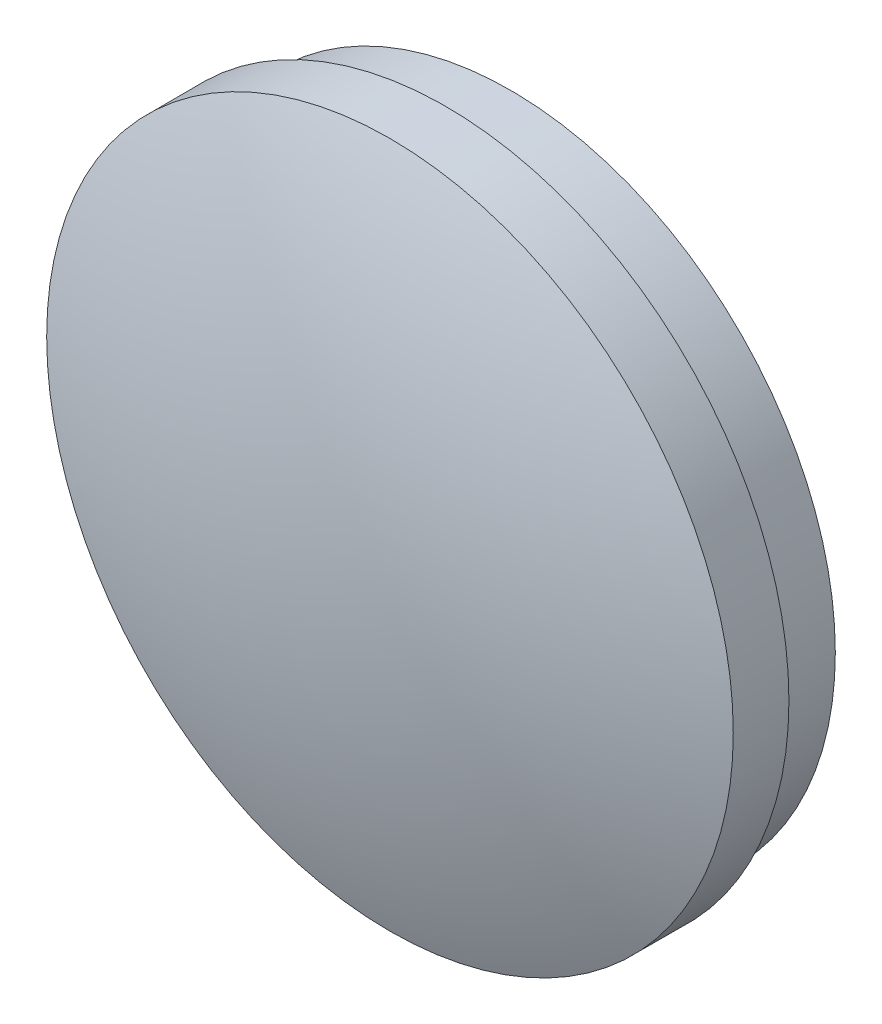
ISO-10303-21;
HEADER;
FILE_DESCRIPTION(('STEP AP214'),'2;1');
FILE_NAME('part.step','',(''),(''),'','','');
FILE_SCHEMA(('AUTOMOTIVE_DESIGN { 1 0 10303 214 1 1 1 1 }'));
ENDSEC;
DATA;
#1=APPLICATION_CONTEXT('core data for automotive mechanical design processes');
#2=APPLICATION_PROTOCOL_DEFINITION('international standard','automotive_design',2000,#1);
#3=PRODUCT_CONTEXT('',#1,'mechanical');
#4=PRODUCT('Part','Part','',(#3));
#5=PRODUCT_RELATED_PRODUCT_CATEGORY('part','',(#4));
#6=PRODUCT_DEFINITION_FORMATION('','',#4);
#7=PRODUCT_DEFINITION_CONTEXT('part definition',#1,'design');
#8=PRODUCT_DEFINITION('design','',#6,#7);
#9=PRODUCT_DEFINITION_SHAPE('','',#8);
#10=(LENGTH_UNIT() NAMED_UNIT(*) SI_UNIT(.MILLI.,.METRE.));
#11=(NAMED_UNIT(*) PLANE_ANGLE_UNIT() SI_UNIT($,.RADIAN.));
#12=(NAMED_UNIT(*) SI_UNIT($,.STERADIAN.) SOLID_ANGLE_UNIT());
#13=UNCERTAINTY_MEASURE_WITH_UNIT(LENGTH_MEASURE(1.E-05),#10,'distance_accuracy_value','');
#14=(GEOMETRIC_REPRESENTATION_CONTEXT(3) GLOBAL_UNCERTAINTY_ASSIGNED_CONTEXT((#13)) GLOBAL_UNIT_ASSIGNED_CONTEXT((#10,
#11,#12)) REPRESENTATION_CONTEXT('',''));
#15=CARTESIAN_POINT('',(0.,0.,0.));
#16=DIRECTION('',(0.,0.,1.));
#17=DIRECTION('',(1.,0.,0.));
#18=AXIS2_PLACEMENT_3D('',#15,#16,#17);
#19=CARTESIAN_POINT('',(0.,0.,-8.));
#20=DIRECTION('',(0.,0.,1.));
#21=DIRECTION('',(1.,0.,0.));
#22=AXIS2_PLACEMENT_3D('',#19,#20,#21);
#23=PLANE('',#22);
#24=CARTESIAN_POINT('',(0.,0.,-8.));
#25=DIRECTION('',(0.,0.,1.));
#26=DIRECTION('',(1.,0.,0.));
#27=AXIS2_PLACEMENT_3D('',#24,#25,#26);
#28=CIRCLE('',#27,6.);
#29=CARTESIAN_POINT('',(6.,0.,-8.));
#30=VERTEX_POINT('',#29);
#31=EDGE_CURVE('E10',#30,#30,#28,.T.);
#32=ORIENTED_EDGE('',*,*,#31,.F.);
#33=EDGE_LOOP('',(#32));
#34=FACE_BOUND('',#33,.T.);
#35=ADVANCED_FACE('F35',(#34),#23,.F.);
#36=CARTESIAN_POINT('',(0.,0.,-8.));
#37=DIRECTION('',(0.,0.,1.));
#38=DIRECTION('',(1.,0.,0.));
#39=AXIS2_PLACEMENT_3D('',#36,#37,#38);
#40=CYLINDRICAL_SURFACE('',#39,6.);
#41=CARTESIAN_POINT('',(0.,0.,0.));
#42=DIRECTION('',(0.,0.,1.));
#43=DIRECTION('',(1.,0.,0.));
#44=AXIS2_PLACEMENT_3D('',#41,#42,#43);
#45=CIRCLE('',#44,6.);
#46=CARTESIAN_POINT('',(6.,0.,0.));
#47=VERTEX_POINT('',#46);
#48=EDGE_CURVE('E41',#47,#47,#45,.T.);
#49=ORIENTED_EDGE('',*,*,#48,.F.);
#50=EDGE_LOOP('',(#49));
#51=FACE_BOUND('',#50,.T.);
#52=ORIENTED_EDGE('',*,*,#31,.T.);
#53=EDGE_LOOP('',(#52));
#54=FACE_BOUND('',#53,.T.);
#55=ADVANCED_FACE('F84',(#51,#54),#40,.T.);
#56=CARTESIAN_POINT('',(0.,6.,0.));
#57=DIRECTION('',(0.,0.,1.));
#58=DIRECTION('',(1.,0.,0.));
#59=AXIS2_PLACEMENT_3D('',#56,#57,#58);
#60=PLANE('',#59);
#61=CARTESIAN_POINT('',(0.,0.,0.));
#62=DIRECTION('',(0.,0.,1.));
#63=DIRECTION('',(1.,0.,0.));
#64=AXIS2_PLACEMENT_3D('',#61,#62,#63);
#65=CIRCLE('',#64,17.5);
#66=CARTESIAN_POINT('',(17.5,0.,0.));
#67=VERTEX_POINT('',#66);
#68=EDGE_CURVE('E45',#67,#67,#65,.T.);
#69=ORIENTED_EDGE('',*,*,#68,.F.);
#70=EDGE_LOOP('',(#69));
#71=FACE_BOUND('',#70,.T.);
#72=ORIENTED_EDGE('',*,*,#48,.T.);
#73=EDGE_LOOP('',(#72));
#74=FACE_BOUND('',#73,.T.);
#75=ADVANCED_FACE('F79',(#71,#74),#60,.F.);
#76=CARTESIAN_POINT('',(0.,0.,-8.));
#77=DIRECTION('',(0.,0.,1.));
#78=DIRECTION('',(1.,0.,0.));
#79=AXIS2_PLACEMENT_3D('',#76,#77,#78);
#80=CYLINDRICAL_SURFACE('',#79,17.5);
#81=CARTESIAN_POINT('',(0.,0.,3.5));
#82=DIRECTION('',(0.,0.,1.));
#83=DIRECTION('',(1.,0.,0.));
#84=AXIS2_PLACEMENT_3D('',#81,#82,#83);
#85=CIRCLE('',#84,17.5);
#86=CARTESIAN_POINT('',(17.5,0.,3.5));
#87=VERTEX_POINT('',#86);
#88=EDGE_CURVE('E50',#87,#87,#85,.T.);
#89=ORIENTED_EDGE('',*,*,#88,.F.);
#90=EDGE_LOOP('',(#89));
#91=FACE_BOUND('',#90,.T.);
#92=ORIENTED_EDGE('',*,*,#68,.T.);
#93=EDGE_LOOP('',(#92));
#94=FACE_BOUND('',#93,.T.);
#95=ADVANCED_FACE('F73',(#91,#94),#80,.T.);
#96=CARTESIAN_POINT('',(0.,17.5,3.5));
#97=DIRECTION('',(0.,0.,1.));
#98=DIRECTION('',(1.,0.,0.));
#99=AXIS2_PLACEMENT_3D('',#96,#97,#98);
#100=PLANE('',#99);
#101=CARTESIAN_POINT('',(0.,0.,3.5));
#102=DIRECTION('',(0.,0.,1.));
#103=DIRECTION('',(1.,0.,0.));
#104=AXIS2_PLACEMENT_3D('',#101,#102,#103);
#105=CIRCLE('',#104,18.5);
#106=CARTESIAN_POINT('',(18.5,0.,3.5));
#107=VERTEX_POINT('',#106);
#108=EDGE_CURVE('E55',#107,#107,#105,.T.);
#109=ORIENTED_EDGE('',*,*,#108,.F.);
#110=EDGE_LOOP('',(#109));
#111=FACE_BOUND('',#110,.T.);
#112=ORIENTED_EDGE('',*,*,#88,.T.);
#113=EDGE_LOOP('',(#112));
#114=FACE_BOUND('',#113,.T.);
#115=ADVANCED_FACE('F67',(#111,#114),#100,.F.);
#116=CARTESIAN_POINT('',(0.,0.,-8.));
#117=DIRECTION('',(0.,0.,1.));
#118=DIRECTION('',(1.,0.,0.));
#119=AXIS2_PLACEMENT_3D('',#116,#117,#118);
#120=CYLINDRICAL_SURFACE('',#119,18.5);
#121=CARTESIAN_POINT('',(0.,0.,6.5));
#122=DIRECTION('',(0.,0.,1.));
#123=DIRECTION('',(1.,0.,0.));
#124=AXIS2_PLACEMENT_3D('',#121,#122,#123);
#125=CIRCLE('',#124,18.5);
#126=CARTESIAN_POINT('',(18.5,0.,6.5));
#127=VERTEX_POINT('',#126);
#128=EDGE_CURVE('E58',#127,#127,#125,.T.);
#129=ORIENTED_EDGE('',*,*,#128,.F.);
#130=EDGE_LOOP('',(#129));
#131=FACE_BOUND('',#130,.T.);
#132=ORIENTED_EDGE('',*,*,#108,.T.);
#133=EDGE_LOOP('',(#132));
#134=FACE_BOUND('',#133,.T.);
#135=ADVANCED_FACE('F64',(#131,#134),#120,.T.);
#136=CARTESIAN_POINT('',(0.,0.,-40.6428571428572));
#137=DIRECTION('',(0.,0.,1.));
#138=DIRECTION('',(0.,1.,0.));
#139=AXIS2_PLACEMENT_3D('',#136,#137,#138);
#140=SPHERICAL_SURFACE('',#139,50.6428571428572);
#141=ORIENTED_EDGE('',*,*,#128,.T.);
#142=EDGE_LOOP('',(#141));
#143=FACE_BOUND('',#142,.T.);
#144=ADVANCED_FACE('F62',(#143),#140,.T.);
#145=CLOSED_SHELL('',(#35,#55,#75,#95,#115,#135,#144));
#146=MANIFOLD_SOLID_BREP('B2',#145);
#147=ADVANCED_BREP_SHAPE_REPRESENTATION('',(#18,#146),#14);
#148=SHAPE_DEFINITION_REPRESENTATION(#9,#147);
ENDSEC;
END-ISO-10303-21;
